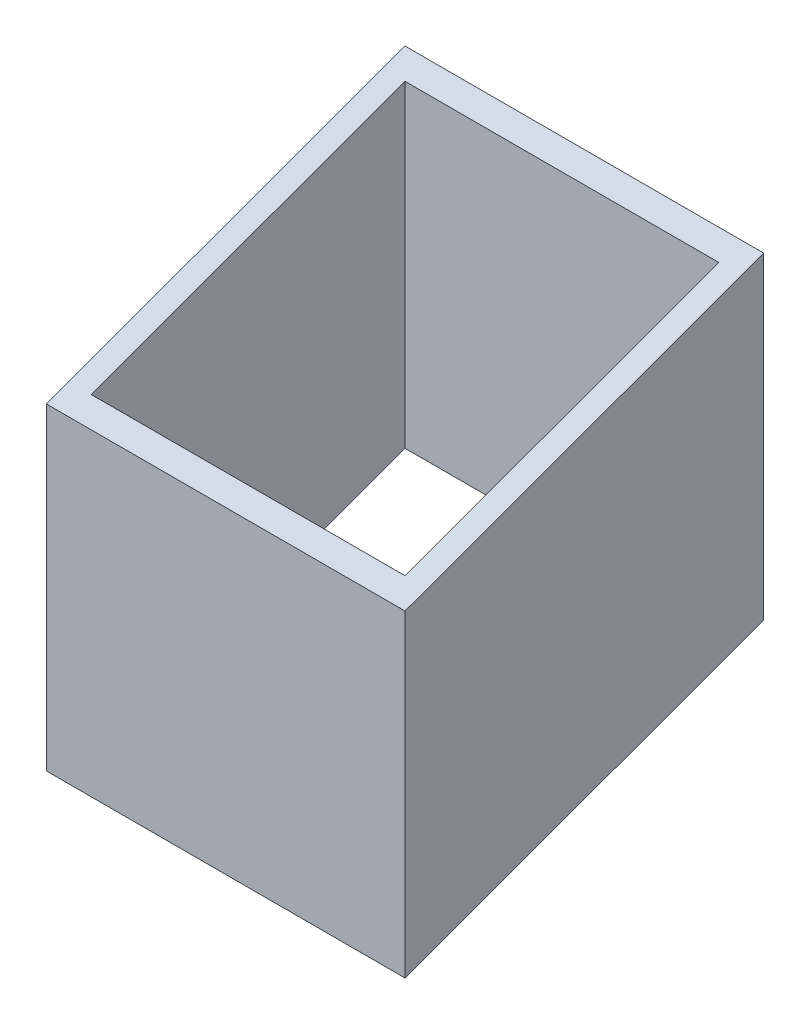
ISO-10303-21;
HEADER;
FILE_DESCRIPTION(('STEP AP214'),'2;1');
FILE_NAME('part.step','',(''),(''),'','','');
FILE_SCHEMA(('AUTOMOTIVE_DESIGN { 1 0 10303 214 1 1 1 1 }'));
ENDSEC;
DATA;
#1=APPLICATION_CONTEXT('core data for automotive mechanical design processes');
#2=APPLICATION_PROTOCOL_DEFINITION('international standard','automotive_design',2000,#1);
#3=PRODUCT_CONTEXT('',#1,'mechanical');
#4=PRODUCT('Part','Part','',(#3));
#5=PRODUCT_RELATED_PRODUCT_CATEGORY('part','',(#4));
#6=PRODUCT_DEFINITION_FORMATION('','',#4);
#7=PRODUCT_DEFINITION_CONTEXT('part definition',#1,'design');
#8=PRODUCT_DEFINITION('design','',#6,#7);
#9=PRODUCT_DEFINITION_SHAPE('','',#8);
#10=(LENGTH_UNIT() NAMED_UNIT(*) SI_UNIT(.MILLI.,.METRE.));
#11=(NAMED_UNIT(*) PLANE_ANGLE_UNIT() SI_UNIT($,.RADIAN.));
#12=(NAMED_UNIT(*) SI_UNIT($,.STERADIAN.) SOLID_ANGLE_UNIT());
#13=UNCERTAINTY_MEASURE_WITH_UNIT(LENGTH_MEASURE(1.E-05),#10,'distance_accuracy_value','');
#14=(GEOMETRIC_REPRESENTATION_CONTEXT(3) GLOBAL_UNCERTAINTY_ASSIGNED_CONTEXT((#13)) GLOBAL_UNIT_ASSIGNED_CONTEXT((#10,
#11,#12)) REPRESENTATION_CONTEXT('',''));
#15=CARTESIAN_POINT('',(0.,0.,0.));
#16=DIRECTION('',(0.,0.,1.));
#17=DIRECTION('',(1.,0.,0.));
#18=AXIS2_PLACEMENT_3D('',#15,#16,#17);
#19=CARTESIAN_POINT('',(2.5,50.,-2.5));
#20=DIRECTION('',(-1.,0.,0.));
#21=DIRECTION('',(0.,0.,1.));
#22=AXIS2_PLACEMENT_3D('',#19,#20,#21);
#23=PLANE('',#22);
#24=DIRECTION('',(0.,-1.,0.));
#25=VECTOR('',#24,1.);
#26=CARTESIAN_POINT('',(2.5,50.,-2.5));
#27=LINE('',#26,#25);
#28=CARTESIAN_POINT('',(2.5,36.3511162150172,-2.5));
#29=VERTEX_POINT('',#28);
#30=CARTESIAN_POINT('',(2.5,0.909925585665485,-2.5));
#31=VERTEX_POINT('',#30);
#32=EDGE_CURVE('E165',#29,#31,#27,.T.);
#33=ORIENTED_EDGE('',*,*,#32,.T.);
#34=DIRECTION('',(0.,0.342020143325663,-0.939692620785911));
#35=VECTOR('',#34,1.);
#36=CARTESIAN_POINT('',(2.5,6.6523734341335,-18.277245796062));
#37=LINE('',#36,#35);
#38=CARTESIAN_POINT('',(2.5,13.6488837849823,-37.5));
#39=VERTEX_POINT('',#38);
#40=EDGE_CURVE('E11',#31,#39,#37,.T.);
#41=ORIENTED_EDGE('',*,*,#40,.T.);
#42=DIRECTION('',(0.,-1.,0.));
#43=VECTOR('',#42,1.);
#44=CARTESIAN_POINT('',(2.5,50.,-37.5));
#45=LINE('',#44,#43);
#46=CARTESIAN_POINT('',(2.5,49.0900744143345,-37.5));
#47=VERTEX_POINT('',#46);
#48=EDGE_CURVE('E158',#47,#39,#45,.T.);
#49=ORIENTED_EDGE('',*,*,#48,.F.);
#50=DIRECTION('',(0.,0.342020143325673,-0.939692620785907));
#51=VECTOR('',#50,1.);
#52=CARTESIAN_POINT('',(2.5,37.9477323183773,-6.88666669151926));
#53=LINE('',#52,#51);
#54=EDGE_CURVE('E52',#29,#47,#53,.T.);
#55=ORIENTED_EDGE('',*,*,#54,.F.);
#56=EDGE_LOOP('',(#33,#41,#49,#55));
#57=FACE_BOUND('',#56,.T.);
#58=ADVANCED_FACE('F43',(#57),#23,.F.);
#59=CARTESIAN_POINT('',(2.5,50.,-37.5));
#60=DIRECTION('',(0.,0.,-1.));
#61=DIRECTION('',(-1.,0.,0.));
#62=AXIS2_PLACEMENT_3D('',#59,#60,#61);
#63=PLANE('',#62);
#64=ORIENTED_EDGE('',*,*,#48,.T.);
#65=DIRECTION('',(1.,0.,0.));
#66=VECTOR('',#65,1.);
#67=CARTESIAN_POINT('',(2.5,13.6488837849823,-37.5));
#68=LINE('',#67,#66);
#69=CARTESIAN_POINT('',(37.5,13.6488837849823,-37.5));
#70=VERTEX_POINT('',#69);
#71=EDGE_CURVE('E67',#39,#70,#68,.T.);
#72=ORIENTED_EDGE('',*,*,#71,.T.);
#73=DIRECTION('',(0.,-1.,0.));
#74=VECTOR('',#73,1.);
#75=CARTESIAN_POINT('',(37.5,50.,-37.5));
#76=LINE('',#75,#74);
#77=CARTESIAN_POINT('',(37.5,49.0900744143345,-37.5));
#78=VERTEX_POINT('',#77);
#79=EDGE_CURVE('E160',#78,#70,#76,.T.);
#80=ORIENTED_EDGE('',*,*,#79,.F.);
#81=DIRECTION('',(1.,0.,0.));
#82=VECTOR('',#81,1.);
#83=CARTESIAN_POINT('',(2.5,49.0900744143345,-37.5));
#84=LINE('',#83,#82);
#85=EDGE_CURVE('E119',#47,#78,#84,.T.);
#86=ORIENTED_EDGE('',*,*,#85,.F.);
#87=EDGE_LOOP('',(#64,#72,#80,#86));
#88=FACE_BOUND('',#87,.T.);
#89=ADVANCED_FACE('F157',(#88),#63,.F.);
#90=CARTESIAN_POINT('',(37.5,50.,-37.5));
#91=DIRECTION('',(1.,0.,0.));
#92=DIRECTION('',(0.,0.,-1.));
#93=AXIS2_PLACEMENT_3D('',#90,#91,#92);
#94=PLANE('',#93);
#95=ORIENTED_EDGE('',*,*,#79,.T.);
#96=DIRECTION('',(0.,-0.342020143325663,0.939692620785911));
#97=VECTOR('',#96,1.);
#98=CARTESIAN_POINT('',(37.5,17.9011566036478,-49.1830235506442));
#99=LINE('',#98,#97);
#100=CARTESIAN_POINT('',(37.5,0.909925585665484,-2.5));
#101=VERTEX_POINT('',#100);
#102=EDGE_CURVE('E187',#70,#101,#99,.T.);
#103=ORIENTED_EDGE('',*,*,#102,.T.);
#104=DIRECTION('',(0.,-1.,0.));
#105=VECTOR('',#104,1.);
#106=CARTESIAN_POINT('',(37.5,50.,-2.5));
#107=LINE('',#106,#105);
#108=CARTESIAN_POINT('',(37.5,36.3511162150172,-2.5));
#109=VERTEX_POINT('',#108);
#110=EDGE_CURVE('E169',#109,#101,#107,.T.);
#111=ORIENTED_EDGE('',*,*,#110,.F.);
#112=DIRECTION('',(0.,-0.342020143325673,0.939692620785907));
#113=VECTOR('',#112,1.);
#114=CARTESIAN_POINT('',(37.5,49.1965154878918,-37.7924444461013));
#115=LINE('',#114,#113);
#116=EDGE_CURVE('E162',#78,#109,#115,.T.);
#117=ORIENTED_EDGE('',*,*,#116,.F.);
#118=EDGE_LOOP('',(#95,#103,#111,#117));
#119=FACE_BOUND('',#118,.T.);
#120=ADVANCED_FACE('F224',(#119),#94,.F.);
#121=CARTESIAN_POINT('',(37.5,50.,-2.5));
#122=DIRECTION('',(0.,0.,1.));
#123=DIRECTION('',(1.,0.,0.));
#124=AXIS2_PLACEMENT_3D('',#121,#122,#123);
#125=PLANE('',#124);
#126=ORIENTED_EDGE('',*,*,#110,.T.);
#127=DIRECTION('',(-1.,0.,0.));
#128=VECTOR('',#127,1.);
#129=CARTESIAN_POINT('',(37.5,0.909925585665487,-2.5));
#130=LINE('',#129,#128);
#131=EDGE_CURVE('E171',#101,#31,#130,.T.);
#132=ORIENTED_EDGE('',*,*,#131,.T.);
#133=ORIENTED_EDGE('',*,*,#32,.F.);
#134=DIRECTION('',(-1.,0.,0.));
#135=VECTOR('',#134,1.);
#136=CARTESIAN_POINT('',(37.5,36.3511162150172,-2.5));
#137=LINE('',#136,#135);
#138=EDGE_CURVE('E59',#109,#29,#137,.T.);
#139=ORIENTED_EDGE('',*,*,#138,.F.);
#140=EDGE_LOOP('',(#126,#132,#133,#139));
#141=FACE_BOUND('',#140,.T.);
#142=ADVANCED_FACE('F228',(#141),#125,.F.);
#143=CARTESIAN_POINT('',(40.,31.2953588842434,11.3905791045431));
#144=DIRECTION('',(0.,0.939692620785907,0.342020143325673));
#145=DIRECTION('',(0.,-0.342020143325673,0.939692620785907));
#146=AXIS2_PLACEMENT_3D('',#143,#144,#145);
#147=PLANE('',#146);
#148=DIRECTION('',(0.,0.342020143325673,-0.939692620785907));
#149=VECTOR('',#148,1.);
#150=CARTESIAN_POINT('',(0.,31.2953588842434,11.3905791045431));
#151=LINE('',#150,#149);
#152=CARTESIAN_POINT('',(0.,35.4411906293517,0.));
#153=VERTEX_POINT('',#152);
#154=CARTESIAN_POINT('',(0.,50.,-40.));
#155=VERTEX_POINT('',#154);
#156=EDGE_CURVE('E202',#153,#155,#151,.T.);
#157=ORIENTED_EDGE('',*,*,#156,.F.);
#158=DIRECTION('',(-1.,0.,0.));
#159=VECTOR('',#158,1.);
#160=CARTESIAN_POINT('',(40.,35.4411906293517,0.));
#161=LINE('',#160,#159);
#162=CARTESIAN_POINT('',(40.,35.4411906293517,0.));
#163=VERTEX_POINT('',#162);
#164=EDGE_CURVE('E197',#163,#153,#161,.T.);
#165=ORIENTED_EDGE('',*,*,#164,.F.);
#166=DIRECTION('',(0.,0.342020143325673,-0.939692620785907));
#167=VECTOR('',#166,1.);
#168=CARTESIAN_POINT('',(40.,31.2953588842434,11.3905791045431));
#169=LINE('',#168,#167);
#170=CARTESIAN_POINT('',(40.,50.,-40.));
#171=VERTEX_POINT('',#170);
#172=EDGE_CURVE('E201',#163,#171,#169,.T.);
#173=ORIENTED_EDGE('',*,*,#172,.T.);
#174=DIRECTION('',(-1.,0.,0.));
#175=VECTOR('',#174,1.);
#176=CARTESIAN_POINT('',(0.,50.,-40.));
#177=LINE('',#176,#175);
#178=EDGE_CURVE('E133',#171,#155,#177,.T.);
#179=ORIENTED_EDGE('',*,*,#178,.T.);
#180=EDGE_LOOP('',(#157,#165,#173,#179));
#181=FACE_BOUND('',#180,.T.);
#182=ORIENTED_EDGE('',*,*,#138,.T.);
#183=ORIENTED_EDGE('',*,*,#54,.T.);
#184=ORIENTED_EDGE('',*,*,#85,.T.);
#185=ORIENTED_EDGE('',*,*,#116,.T.);
#186=EDGE_LOOP('',(#182,#183,#184,#185));
#187=FACE_BOUND('',#186,.T.);
#188=ADVANCED_FACE('F148',(#181,#187),#147,.T.);
#189=CARTESIAN_POINT('',(40.,0.,0.));
#190=DIRECTION('',(0.,0.939692620785911,0.342020143325663));
#191=DIRECTION('',(0.,-0.342020143325663,0.939692620785911));
#192=AXIS2_PLACEMENT_3D('',#189,#190,#191);
#193=PLANE('',#192);
#194=DIRECTION('',(0.,0.342020143325663,-0.939692620785911));
#195=VECTOR('',#194,1.);
#196=CARTESIAN_POINT('',(0.,0.,0.));
#197=LINE('',#196,#195);
#198=CARTESIAN_POINT('',(0.,0.,0.));
#199=VERTEX_POINT('',#198);
#200=CARTESIAN_POINT('',(0.,14.5588093706478,-40.));
#201=VERTEX_POINT('',#200);
#202=EDGE_CURVE('E113',#199,#201,#197,.T.);
#203=ORIENTED_EDGE('',*,*,#202,.T.);
#204=DIRECTION('',(-1.,0.,0.));
#205=VECTOR('',#204,1.);
#206=CARTESIAN_POINT('',(40.,14.5588093706478,-40.));
#207=LINE('',#206,#205);
#208=CARTESIAN_POINT('',(40.,14.5588093706478,-40.));
#209=VERTEX_POINT('',#208);
#210=EDGE_CURVE('E107',#209,#201,#207,.T.);
#211=ORIENTED_EDGE('',*,*,#210,.F.);
#212=DIRECTION('',(0.,0.342020143325663,-0.939692620785911));
#213=VECTOR('',#212,1.);
#214=CARTESIAN_POINT('',(40.,0.,0.));
#215=LINE('',#214,#213);
#216=CARTESIAN_POINT('',(40.,0.,0.));
#217=VERTEX_POINT('',#216);
#218=EDGE_CURVE('E110',#217,#209,#215,.T.);
#219=ORIENTED_EDGE('',*,*,#218,.F.);
#220=DIRECTION('',(1.,0.,0.));
#221=VECTOR('',#220,1.);
#222=CARTESIAN_POINT('',(0.,0.,0.));
#223=LINE('',#222,#221);
#224=EDGE_CURVE('E176',#199,#217,#223,.T.);
#225=ORIENTED_EDGE('',*,*,#224,.F.);
#226=EDGE_LOOP('',(#203,#211,#219,#225));
#227=FACE_BOUND('',#226,.T.);
#228=ORIENTED_EDGE('',*,*,#102,.F.);
#229=ORIENTED_EDGE('',*,*,#71,.F.);
#230=ORIENTED_EDGE('',*,*,#40,.F.);
#231=ORIENTED_EDGE('',*,*,#131,.F.);
#232=EDGE_LOOP('',(#228,#229,#230,#231));
#233=FACE_BOUND('',#232,.T.);
#234=ADVANCED_FACE('F109',(#227,#233),#193,.F.);
#235=CARTESIAN_POINT('',(0.,50.,0.));
#236=DIRECTION('',(1.,0.,0.));
#237=DIRECTION('',(0.,0.,-1.));
#238=AXIS2_PLACEMENT_3D('',#235,#236,#237);
#239=PLANE('',#238);
#240=DIRECTION('',(0.,-1.,0.));
#241=VECTOR('',#240,1.);
#242=CARTESIAN_POINT('',(0.,50.,-40.));
#243=LINE('',#242,#241);
#244=EDGE_CURVE('E135',#155,#201,#243,.T.);
#245=ORIENTED_EDGE('',*,*,#244,.T.);
#246=ORIENTED_EDGE('',*,*,#202,.F.);
#247=DIRECTION('',(0.,-1.,0.));
#248=VECTOR('',#247,1.);
#249=CARTESIAN_POINT('',(0.,50.,0.));
#250=LINE('',#249,#248);
#251=EDGE_CURVE('E139',#153,#199,#250,.T.);
#252=ORIENTED_EDGE('',*,*,#251,.F.);
#253=ORIENTED_EDGE('',*,*,#156,.T.);
#254=EDGE_LOOP('',(#245,#246,#252,#253));
#255=FACE_BOUND('',#254,.T.);
#256=ADVANCED_FACE('F45',(#255),#239,.F.);
#257=CARTESIAN_POINT('',(0.,50.,0.));
#258=DIRECTION('',(0.,0.,-1.));
#259=DIRECTION('',(-1.,0.,0.));
#260=AXIS2_PLACEMENT_3D('',#257,#258,#259);
#261=PLANE('',#260);
#262=ORIENTED_EDGE('',*,*,#164,.T.);
#263=ORIENTED_EDGE('',*,*,#251,.T.);
#264=ORIENTED_EDGE('',*,*,#224,.T.);
#265=DIRECTION('',(0.,-1.,0.));
#266=VECTOR('',#265,1.);
#267=CARTESIAN_POINT('',(40.,50.,0.));
#268=LINE('',#267,#266);
#269=EDGE_CURVE('E128',#163,#217,#268,.T.);
#270=ORIENTED_EDGE('',*,*,#269,.F.);
#271=EDGE_LOOP('',(#262,#263,#264,#270));
#272=FACE_BOUND('',#271,.T.);
#273=ADVANCED_FACE('F210',(#272),#261,.F.);
#274=CARTESIAN_POINT('',(40.,50.,0.));
#275=DIRECTION('',(-1.,0.,0.));
#276=DIRECTION('',(0.,0.,1.));
#277=AXIS2_PLACEMENT_3D('',#274,#275,#276);
#278=PLANE('',#277);
#279=ORIENTED_EDGE('',*,*,#269,.T.);
#280=ORIENTED_EDGE('',*,*,#218,.T.);
#281=DIRECTION('',(0.,-1.,0.));
#282=VECTOR('',#281,1.);
#283=CARTESIAN_POINT('',(40.,50.,-40.));
#284=LINE('',#283,#282);
#285=EDGE_CURVE('E125',#171,#209,#284,.T.);
#286=ORIENTED_EDGE('',*,*,#285,.F.);
#287=ORIENTED_EDGE('',*,*,#172,.F.);
#288=EDGE_LOOP('',(#279,#280,#286,#287));
#289=FACE_BOUND('',#288,.T.);
#290=ADVANCED_FACE('F123',(#289),#278,.F.);
#291=CARTESIAN_POINT('',(0.,50.,-40.));
#292=DIRECTION('',(0.,0.,1.));
#293=DIRECTION('',(1.,0.,0.));
#294=AXIS2_PLACEMENT_3D('',#291,#292,#293);
#295=PLANE('',#294);
#296=ORIENTED_EDGE('',*,*,#285,.T.);
#297=ORIENTED_EDGE('',*,*,#210,.T.);
#298=ORIENTED_EDGE('',*,*,#244,.F.);
#299=ORIENTED_EDGE('',*,*,#178,.F.);
#300=EDGE_LOOP('',(#296,#297,#298,#299));
#301=FACE_BOUND('',#300,.T.);
#302=ADVANCED_FACE('F132',(#301),#295,.F.);
#303=CLOSED_SHELL('',(#58,#89,#120,#142,#188,#234,#256,#273,#290,#302));
#304=MANIFOLD_SOLID_BREP('B2',#303);
#305=ADVANCED_BREP_SHAPE_REPRESENTATION('',(#18,#304),#14);
#306=SHAPE_DEFINITION_REPRESENTATION(#9,#305);
ENDSEC;
END-ISO-10303-21;
